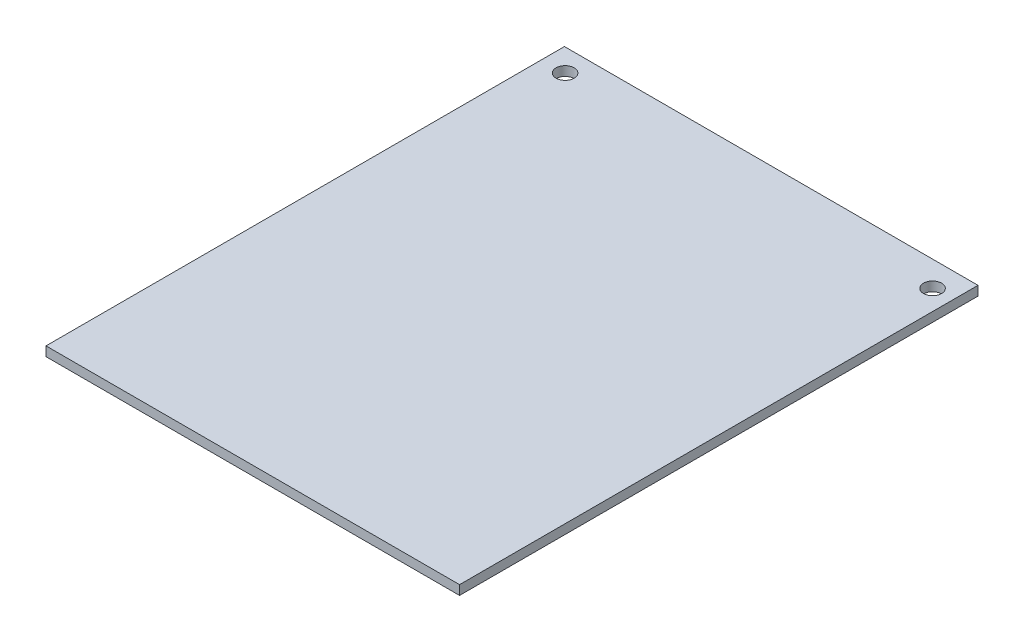
ISO-10303-21;
HEADER;
FILE_DESCRIPTION(('STEP AP214'),'2;1');
FILE_NAME('part.step','',(''),(''),'','','');
FILE_SCHEMA(('AUTOMOTIVE_DESIGN { 1 0 10303 214 1 1 1 1 }'));
ENDSEC;
DATA;
#1=APPLICATION_CONTEXT('core data for automotive mechanical design processes');
#2=APPLICATION_PROTOCOL_DEFINITION('international standard','automotive_design',2000,#1);
#3=PRODUCT_CONTEXT('',#1,'mechanical');
#4=PRODUCT('Part','Part','',(#3));
#5=PRODUCT_RELATED_PRODUCT_CATEGORY('part','',(#4));
#6=PRODUCT_DEFINITION_FORMATION('','',#4);
#7=PRODUCT_DEFINITION_CONTEXT('part definition',#1,'design');
#8=PRODUCT_DEFINITION('design','',#6,#7);
#9=PRODUCT_DEFINITION_SHAPE('','',#8);
#10=(LENGTH_UNIT() NAMED_UNIT(*) SI_UNIT(.MILLI.,.METRE.));
#11=(NAMED_UNIT(*) PLANE_ANGLE_UNIT() SI_UNIT($,.RADIAN.));
#12=(NAMED_UNIT(*) SI_UNIT($,.STERADIAN.) SOLID_ANGLE_UNIT());
#13=UNCERTAINTY_MEASURE_WITH_UNIT(LENGTH_MEASURE(1.E-05),#10,'distance_accuracy_value','');
#14=(GEOMETRIC_REPRESENTATION_CONTEXT(3) GLOBAL_UNCERTAINTY_ASSIGNED_CONTEXT((#13)) GLOBAL_UNIT_ASSIGNED_CONTEXT((#10,
#11,#12)) REPRESENTATION_CONTEXT('',''));
#15=CARTESIAN_POINT('',(0.,0.,0.));
#16=DIRECTION('',(0.,0.,1.));
#17=DIRECTION('',(1.,0.,0.));
#18=AXIS2_PLACEMENT_3D('',#15,#16,#17);
#19=CARTESIAN_POINT('',(0.,1.66,0.));
#20=DIRECTION('',(0.,1.,0.));
#21=DIRECTION('',(0.,0.,1.));
#22=AXIS2_PLACEMENT_3D('',#19,#20,#21);
#23=PLANE('',#22);
#24=CARTESIAN_POINT('',(27.6674074074074,1.66,-33.1692592592593));
#25=DIRECTION('',(0.,1.,0.));
#26=DIRECTION('',(0.,0.,1.));
#27=AXIS2_PLACEMENT_3D('',#24,#25,#26);
#28=CIRCLE('',#27,1.6);
#29=CARTESIAN_POINT('',(27.6674074074074,1.66,-34.7692592592593));
#30=VERTEX_POINT('',#29);
#31=EDGE_CURVE('E100',#30,#30,#28,.T.);
#32=ORIENTED_EDGE('',*,*,#31,.F.);
#33=EDGE_LOOP('',(#32));
#34=FACE_BOUND('',#33,.T.);
#35=DIRECTION('',(0.,0.,1.));
#36=VECTOR('',#35,1.);
#37=CARTESIAN_POINT('',(-42.0325925925926,1.66,-37.6592592592593));
#38=LINE('',#37,#36);
#39=CARTESIAN_POINT('',(-42.0325925925926,1.66,-37.6592592592593));
#40=VERTEX_POINT('',#39);
#41=CARTESIAN_POINT('',(-42.0325925925926,1.66,54.1807407407407));
#42=VERTEX_POINT('',#41);
#43=EDGE_CURVE('E85',#40,#42,#38,.T.);
#44=ORIENTED_EDGE('',*,*,#43,.T.);
#45=DIRECTION('',(1.,0.,0.));
#46=VECTOR('',#45,1.);
#47=CARTESIAN_POINT('',(-42.0325925925926,1.66,54.1807407407407));
#48=LINE('',#47,#46);
#49=CARTESIAN_POINT('',(31.2274074074074,1.66,54.1807407407407));
#50=VERTEX_POINT('',#49);
#51=EDGE_CURVE('E80',#42,#50,#48,.T.);
#52=ORIENTED_EDGE('',*,*,#51,.T.);
#53=DIRECTION('',(0.,0.,-1.));
#54=VECTOR('',#53,1.);
#55=CARTESIAN_POINT('',(31.2274074074074,1.66,-37.6592592592593));
#56=LINE('',#55,#54);
#57=CARTESIAN_POINT('',(31.2274074074074,1.66,-37.6592592592593));
#58=VERTEX_POINT('',#57);
#59=EDGE_CURVE('E83',#50,#58,#56,.T.);
#60=ORIENTED_EDGE('',*,*,#59,.T.);
#61=DIRECTION('',(-1.,0.,0.));
#62=VECTOR('',#61,1.);
#63=CARTESIAN_POINT('',(-42.0325925925926,1.66,-37.6592592592593));
#64=LINE('',#63,#62);
#65=EDGE_CURVE('E50',#58,#40,#64,.T.);
#66=ORIENTED_EDGE('',*,*,#65,.T.);
#67=EDGE_LOOP('',(#44,#52,#60,#66));
#68=FACE_BOUND('',#67,.T.);
#69=CARTESIAN_POINT('',(-37.9125925925926,1.66,-33.6592592592593));
#70=DIRECTION('',(0.,1.,0.));
#71=DIRECTION('',(0.,0.,1.));
#72=AXIS2_PLACEMENT_3D('',#69,#70,#71);
#73=CIRCLE('',#72,1.6);
#74=CARTESIAN_POINT('',(-37.9125925925926,1.66,-35.2592592592593));
#75=VERTEX_POINT('',#74);
#76=EDGE_CURVE('E115',#75,#75,#73,.T.);
#77=ORIENTED_EDGE('',*,*,#76,.F.);
#78=EDGE_LOOP('',(#77));
#79=FACE_BOUND('',#78,.T.);
#80=ADVANCED_FACE('F33',(#34,#68,#79),#23,.T.);
#81=CARTESIAN_POINT('',(0.,0.,0.));
#82=DIRECTION('',(0.,1.,0.));
#83=DIRECTION('',(0.,0.,1.));
#84=AXIS2_PLACEMENT_3D('',#81,#82,#83);
#85=PLANE('',#84);
#86=DIRECTION('',(0.,0.,1.));
#87=VECTOR('',#86,1.);
#88=CARTESIAN_POINT('',(-42.0325925925926,0.,-37.6592592592593));
#89=LINE('',#88,#87);
#90=CARTESIAN_POINT('',(-42.0325925925926,0.,-37.6592592592593));
#91=VERTEX_POINT('',#90);
#92=CARTESIAN_POINT('',(-42.0325925925926,0.,54.1807407407407));
#93=VERTEX_POINT('',#92);
#94=EDGE_CURVE('E97',#91,#93,#89,.T.);
#95=ORIENTED_EDGE('',*,*,#94,.F.);
#96=DIRECTION('',(-1.,0.,0.));
#97=VECTOR('',#96,1.);
#98=CARTESIAN_POINT('',(-42.0325925925926,0.,-37.6592592592593));
#99=LINE('',#98,#97);
#100=CARTESIAN_POINT('',(31.2274074074074,0.,-37.6592592592593));
#101=VERTEX_POINT('',#100);
#102=EDGE_CURVE('E73',#101,#91,#99,.T.);
#103=ORIENTED_EDGE('',*,*,#102,.F.);
#104=DIRECTION('',(0.,0.,-1.));
#105=VECTOR('',#104,1.);
#106=CARTESIAN_POINT('',(31.2274074074074,0.,-37.6592592592593));
#107=LINE('',#106,#105);
#108=CARTESIAN_POINT('',(31.2274074074074,0.,54.1807407407407));
#109=VERTEX_POINT('',#108);
#110=EDGE_CURVE('E67',#109,#101,#107,.T.);
#111=ORIENTED_EDGE('',*,*,#110,.F.);
#112=DIRECTION('',(1.,0.,0.));
#113=VECTOR('',#112,1.);
#114=CARTESIAN_POINT('',(-42.0325925925926,0.,54.1807407407407));
#115=LINE('',#114,#113);
#116=EDGE_CURVE('E89',#93,#109,#115,.T.);
#117=ORIENTED_EDGE('',*,*,#116,.F.);
#118=EDGE_LOOP('',(#95,#103,#111,#117));
#119=FACE_BOUND('',#118,.T.);
#120=CARTESIAN_POINT('',(27.6674074074074,0.,-33.1692592592593));
#121=DIRECTION('',(0.,1.,0.));
#122=DIRECTION('',(0.,0.,1.));
#123=AXIS2_PLACEMENT_3D('',#120,#121,#122);
#124=CIRCLE('',#123,1.6);
#125=CARTESIAN_POINT('',(27.6674074074074,0.,-34.7692592592593));
#126=VERTEX_POINT('',#125);
#127=EDGE_CURVE('E112',#126,#126,#124,.T.);
#128=ORIENTED_EDGE('',*,*,#127,.T.);
#129=EDGE_LOOP('',(#128));
#130=FACE_BOUND('',#129,.T.);
#131=CARTESIAN_POINT('',(-37.9125925925926,0.,-33.6592592592593));
#132=DIRECTION('',(0.,1.,0.));
#133=DIRECTION('',(0.,0.,1.));
#134=AXIS2_PLACEMENT_3D('',#131,#132,#133);
#135=CIRCLE('',#134,1.6);
#136=CARTESIAN_POINT('',(-37.9125925925926,0.,-35.2592592592593));
#137=VERTEX_POINT('',#136);
#138=EDGE_CURVE('E118',#137,#137,#135,.T.);
#139=ORIENTED_EDGE('',*,*,#138,.T.);
#140=EDGE_LOOP('',(#139));
#141=FACE_BOUND('',#140,.T.);
#142=ADVANCED_FACE('F108',(#119,#130,#141),#85,.F.);
#143=CARTESIAN_POINT('',(-42.0325925925926,1.66,-37.6592592592593));
#144=DIRECTION('',(1.,0.,0.));
#145=DIRECTION('',(0.,0.,-1.));
#146=AXIS2_PLACEMENT_3D('',#143,#144,#145);
#147=PLANE('',#146);
#148=ORIENTED_EDGE('',*,*,#94,.T.);
#149=DIRECTION('',(0.,-1.,0.));
#150=VECTOR('',#149,1.);
#151=CARTESIAN_POINT('',(-42.0325925925926,1.66,54.1807407407407));
#152=LINE('',#151,#150);
#153=EDGE_CURVE('E11',#42,#93,#152,.T.);
#154=ORIENTED_EDGE('',*,*,#153,.F.);
#155=ORIENTED_EDGE('',*,*,#43,.F.);
#156=DIRECTION('',(0.,-1.,0.));
#157=VECTOR('',#156,1.);
#158=CARTESIAN_POINT('',(-42.0325925925926,1.66,-37.6592592592593));
#159=LINE('',#158,#157);
#160=EDGE_CURVE('E93',#40,#91,#159,.T.);
#161=ORIENTED_EDGE('',*,*,#160,.T.);
#162=EDGE_LOOP('',(#148,#154,#155,#161));
#163=FACE_BOUND('',#162,.T.);
#164=ADVANCED_FACE('F35',(#163),#147,.F.);
#165=CARTESIAN_POINT('',(-42.0325925925926,1.66,54.1807407407407));
#166=DIRECTION('',(0.,0.,-1.));
#167=DIRECTION('',(-1.,0.,0.));
#168=AXIS2_PLACEMENT_3D('',#165,#166,#167);
#169=PLANE('',#168);
#170=ORIENTED_EDGE('',*,*,#116,.T.);
#171=DIRECTION('',(0.,-1.,0.));
#172=VECTOR('',#171,1.);
#173=CARTESIAN_POINT('',(31.2274074074074,1.66,54.1807407407407));
#174=LINE('',#173,#172);
#175=EDGE_CURVE('E42',#50,#109,#174,.T.);
#176=ORIENTED_EDGE('',*,*,#175,.F.);
#177=ORIENTED_EDGE('',*,*,#51,.F.);
#178=ORIENTED_EDGE('',*,*,#153,.T.);
#179=EDGE_LOOP('',(#170,#176,#177,#178));
#180=FACE_BOUND('',#179,.T.);
#181=ADVANCED_FACE('F88',(#180),#169,.F.);
#182=CARTESIAN_POINT('',(31.2274074074074,1.66,-37.6592592592593));
#183=DIRECTION('',(-1.,0.,0.));
#184=DIRECTION('',(0.,0.,1.));
#185=AXIS2_PLACEMENT_3D('',#182,#183,#184);
#186=PLANE('',#185);
#187=ORIENTED_EDGE('',*,*,#110,.T.);
#188=DIRECTION('',(0.,-1.,0.));
#189=VECTOR('',#188,1.);
#190=CARTESIAN_POINT('',(31.2274074074074,1.66,-37.6592592592593));
#191=LINE('',#190,#189);
#192=EDGE_CURVE('E90',#58,#101,#191,.T.);
#193=ORIENTED_EDGE('',*,*,#192,.F.);
#194=ORIENTED_EDGE('',*,*,#59,.F.);
#195=ORIENTED_EDGE('',*,*,#175,.T.);
#196=EDGE_LOOP('',(#187,#193,#194,#195));
#197=FACE_BOUND('',#196,.T.);
#198=ADVANCED_FACE('F91',(#197),#186,.F.);
#199=CARTESIAN_POINT('',(-42.0325925925926,1.66,-37.6592592592593));
#200=DIRECTION('',(0.,0.,1.));
#201=DIRECTION('',(1.,0.,0.));
#202=AXIS2_PLACEMENT_3D('',#199,#200,#201);
#203=PLANE('',#202);
#204=ORIENTED_EDGE('',*,*,#102,.T.);
#205=ORIENTED_EDGE('',*,*,#160,.F.);
#206=ORIENTED_EDGE('',*,*,#65,.F.);
#207=ORIENTED_EDGE('',*,*,#192,.T.);
#208=EDGE_LOOP('',(#204,#205,#206,#207));
#209=FACE_BOUND('',#208,.T.);
#210=ADVANCED_FACE('F105',(#209),#203,.F.);
#211=CARTESIAN_POINT('',(27.6674074074074,1.66,-33.1692592592593));
#212=DIRECTION('',(0.,-1.,0.));
#213=DIRECTION('',(0.,0.,-1.));
#214=AXIS2_PLACEMENT_3D('',#211,#212,#213);
#215=CYLINDRICAL_SURFACE('',#214,1.6);
#216=CARTESIAN_POINT('',(27.6674074074074,1.66,-34.7692592592593));
#217=CARTESIAN_POINT('',(27.6674074074074,1.64270833333333,-34.7692592592593));
#218=CARTESIAN_POINT('',(27.6674074074074,1.62541666666667,-34.7692592592593));
#219=CARTESIAN_POINT('',(27.6674074074074,1.59083333333333,-34.7692592592593));
#220=CARTESIAN_POINT('',(27.6674074074074,1.57354166666667,-34.7692592592593));
#221=CARTESIAN_POINT('',(27.6674074074074,1.53895833333333,-34.7692592592593));
#222=CARTESIAN_POINT('',(27.6674074074074,1.52166666666667,-34.7692592592593));
#223=CARTESIAN_POINT('',(27.6674074074074,1.48708333333333,-34.7692592592593));
#224=CARTESIAN_POINT('',(27.6674074074074,1.46979166666667,-34.7692592592593));
#225=CARTESIAN_POINT('',(27.6674074074074,1.43520833333333,-34.7692592592593));
#226=CARTESIAN_POINT('',(27.6674074074074,1.41791666666667,-34.7692592592593));
#227=CARTESIAN_POINT('',(27.6674074074074,1.38333333333333,-34.7692592592593));
#228=CARTESIAN_POINT('',(27.6674074074074,1.36604166666667,-34.7692592592593));
#229=CARTESIAN_POINT('',(27.6674074074074,1.33145833333333,-34.7692592592593));
#230=CARTESIAN_POINT('',(27.6674074074074,1.31416666666667,-34.7692592592593));
#231=CARTESIAN_POINT('',(27.6674074074074,1.27958333333333,-34.7692592592593));
#232=CARTESIAN_POINT('',(27.6674074074074,1.26229166666667,-34.7692592592593));
#233=CARTESIAN_POINT('',(27.6674074074074,1.22770833333333,-34.7692592592593));
#234=CARTESIAN_POINT('',(27.6674074074074,1.21041666666667,-34.7692592592593));
#235=CARTESIAN_POINT('',(27.6674074074074,1.17583333333333,-34.7692592592593));
#236=CARTESIAN_POINT('',(27.6674074074074,1.15854166666667,-34.7692592592593));
#237=CARTESIAN_POINT('',(27.6674074074074,1.12395833333333,-34.7692592592593));
#238=CARTESIAN_POINT('',(27.6674074074074,1.10666666666667,-34.7692592592593));
#239=CARTESIAN_POINT('',(27.6674074074074,1.07208333333333,-34.7692592592593));
#240=CARTESIAN_POINT('',(27.6674074074074,1.05479166666667,-34.7692592592593));
#241=CARTESIAN_POINT('',(27.6674074074074,1.02020833333333,-34.7692592592593));
#242=CARTESIAN_POINT('',(27.6674074074074,1.00291666666667,-34.7692592592593));
#243=CARTESIAN_POINT('',(27.6674074074074,0.968333333333333,-34.7692592592593));
#244=CARTESIAN_POINT('',(27.6674074074074,0.951041666666667,-34.7692592592593));
#245=CARTESIAN_POINT('',(27.6674074074074,0.916458333333333,-34.7692592592593));
#246=CARTESIAN_POINT('',(27.6674074074074,0.899166666666667,-34.7692592592593));
#247=CARTESIAN_POINT('',(27.6674074074074,0.864583333333333,-34.7692592592593));
#248=CARTESIAN_POINT('',(27.6674074074074,0.847291666666667,-34.7692592592593));
#249=CARTESIAN_POINT('',(27.6674074074074,0.812708333333333,-34.7692592592593));
#250=CARTESIAN_POINT('',(27.6674074074074,0.795416666666666,-34.7692592592593));
#251=CARTESIAN_POINT('',(27.6674074074074,0.760833333333333,-34.7692592592593));
#252=CARTESIAN_POINT('',(27.6674074074074,0.743541666666667,-34.7692592592593));
#253=CARTESIAN_POINT('',(27.6674074074074,0.708958333333333,-34.7692592592593));
#254=CARTESIAN_POINT('',(27.6674074074074,0.691666666666667,-34.7692592592593));
#255=CARTESIAN_POINT('',(27.6674074074074,0.657083333333333,-34.7692592592593));
#256=CARTESIAN_POINT('',(27.6674074074074,0.639791666666666,-34.7692592592593));
#257=CARTESIAN_POINT('',(27.6674074074074,0.605208333333333,-34.7692592592593));
#258=CARTESIAN_POINT('',(27.6674074074074,0.587916666666667,-34.7692592592593));
#259=CARTESIAN_POINT('',(27.6674074074074,0.553333333333333,-34.7692592592593));
#260=CARTESIAN_POINT('',(27.6674074074074,0.536041666666667,-34.7692592592593));
#261=CARTESIAN_POINT('',(27.6674074074074,0.501458333333333,-34.7692592592593));
#262=CARTESIAN_POINT('',(27.6674074074074,0.484166666666667,-34.7692592592593));
#263=CARTESIAN_POINT('',(27.6674074074074,0.449583333333333,-34.7692592592593));
#264=CARTESIAN_POINT('',(27.6674074074074,0.432291666666666,-34.7692592592593));
#265=CARTESIAN_POINT('',(27.6674074074074,0.397708333333333,-34.7692592592593));
#266=CARTESIAN_POINT('',(27.6674074074074,0.380416666666666,-34.7692592592593));
#267=CARTESIAN_POINT('',(27.6674074074074,0.345833333333333,-34.7692592592593));
#268=CARTESIAN_POINT('',(27.6674074074074,0.328541666666667,-34.7692592592593));
#269=CARTESIAN_POINT('',(27.6674074074074,0.293958333333333,-34.7692592592593));
#270=CARTESIAN_POINT('',(27.6674074074074,0.276666666666667,-34.7692592592593));
#271=CARTESIAN_POINT('',(27.6674074074074,0.242083333333333,-34.7692592592593));
#272=CARTESIAN_POINT('',(27.6674074074074,0.224791666666666,-34.7692592592593));
#273=CARTESIAN_POINT('',(27.6674074074074,0.190208333333333,-34.7692592592593));
#274=CARTESIAN_POINT('',(27.6674074074074,0.172916666666666,-34.7692592592593));
#275=CARTESIAN_POINT('',(27.6674074074074,0.138333333333333,-34.7692592592593));
#276=CARTESIAN_POINT('',(27.6674074074074,0.121041666666667,-34.7692592592593));
#277=CARTESIAN_POINT('',(27.6674074074074,0.0864583333333332,-34.7692592592593));
#278=CARTESIAN_POINT('',(27.6674074074074,0.0691666666666665,-34.7692592592593));
#279=CARTESIAN_POINT('',(27.6674074074074,0.0345833333333332,-34.7692592592593));
#280=CARTESIAN_POINT('',(27.6674074074074,0.0172916666666665,-34.7692592592593));
#281=CARTESIAN_POINT('',(27.6674074074074,0.,-34.7692592592593));
#282=B_SPLINE_CURVE_WITH_KNOTS('',3,(#216,#217,#218,#219,#220,#221,#222,#223,#224,#225,#226,
#227,#228,#229,#230,#231,#232,#233,#234,#235,#236,#237,#238,#239,#240,#241,#242,#243,#244,#245,
#246,#247,#248,#249,#250,#251,#252,#253,#254,#255,#256,#257,#258,#259,#260,#261,#262,#263,#264,
#265,#266,#267,#268,#269,#270,#271,#272,#273,#274,#275,#276,#277,#278,#279,#280,#281),
.UNSPECIFIED.,.F.,.F.,(4,2,2,2,2,2,2,2,2,2,2,2,2,2,2,2,2,2,2,2,2,2,2,2,2,2,2,2,2,2,2,2,4),(0.,
0.0518749999999998,0.10375,0.155625,0.2075,0.259375,0.31125,0.363125,0.415,0.466875,0.51875,
0.570625,0.6225,0.674375,0.72625,0.778125,0.83,0.881875,0.93375,0.985625,1.0375,1.089375,
1.14125,1.193125,1.245,1.296875,1.34875,1.400625,1.4525,1.504375,1.55625,1.608125,1.66),.UNSPECIFIED.);
#283=EDGE_CURVE('BSEAM135',#30,#126,#282,.T.);
#284=ORIENTED_EDGE('',*,*,#31,.T.);
#285=ORIENTED_EDGE('',*,*,#127,.F.);
#286=ORIENTED_EDGE('',*,*,#283,.T.);
#287=ORIENTED_EDGE('',*,*,#283,.F.);
#288=EDGE_LOOP('',(#284,#286,#285,#287));
#289=FACE_BOUND('',#288,.T.);
#290=ADVANCED_FACE('F135',(#289),#215,.F.);
#291=CARTESIAN_POINT('',(-37.9125925925926,1.66,-33.6592592592593));
#292=DIRECTION('',(0.,-1.,0.));
#293=DIRECTION('',(0.,0.,-1.));
#294=AXIS2_PLACEMENT_3D('',#291,#292,#293);
#295=CYLINDRICAL_SURFACE('',#294,1.6);
#296=CARTESIAN_POINT('',(-37.9125925925926,1.66,-35.2592592592593));
#297=CARTESIAN_POINT('',(-37.9125925925926,1.64270833333333,-35.2592592592593));
#298=CARTESIAN_POINT('',(-37.9125925925926,1.62541666666667,-35.2592592592593));
#299=CARTESIAN_POINT('',(-37.9125925925926,1.59083333333333,-35.2592592592593));
#300=CARTESIAN_POINT('',(-37.9125925925926,1.57354166666667,-35.2592592592593));
#301=CARTESIAN_POINT('',(-37.9125925925926,1.53895833333333,-35.2592592592593));
#302=CARTESIAN_POINT('',(-37.9125925925926,1.52166666666667,-35.2592592592593));
#303=CARTESIAN_POINT('',(-37.9125925925926,1.48708333333333,-35.2592592592593));
#304=CARTESIAN_POINT('',(-37.9125925925926,1.46979166666667,-35.2592592592593));
#305=CARTESIAN_POINT('',(-37.9125925925926,1.43520833333333,-35.2592592592593));
#306=CARTESIAN_POINT('',(-37.9125925925926,1.41791666666667,-35.2592592592593));
#307=CARTESIAN_POINT('',(-37.9125925925926,1.38333333333333,-35.2592592592593));
#308=CARTESIAN_POINT('',(-37.9125925925926,1.36604166666667,-35.2592592592593));
#309=CARTESIAN_POINT('',(-37.9125925925926,1.33145833333333,-35.2592592592593));
#310=CARTESIAN_POINT('',(-37.9125925925926,1.31416666666667,-35.2592592592593));
#311=CARTESIAN_POINT('',(-37.9125925925926,1.27958333333333,-35.2592592592593));
#312=CARTESIAN_POINT('',(-37.9125925925926,1.26229166666667,-35.2592592592593));
#313=CARTESIAN_POINT('',(-37.9125925925926,1.22770833333333,-35.2592592592593));
#314=CARTESIAN_POINT('',(-37.9125925925926,1.21041666666667,-35.2592592592593));
#315=CARTESIAN_POINT('',(-37.9125925925926,1.17583333333333,-35.2592592592593));
#316=CARTESIAN_POINT('',(-37.9125925925926,1.15854166666667,-35.2592592592593));
#317=CARTESIAN_POINT('',(-37.9125925925926,1.12395833333333,-35.2592592592593));
#318=CARTESIAN_POINT('',(-37.9125925925926,1.10666666666667,-35.2592592592593));
#319=CARTESIAN_POINT('',(-37.9125925925926,1.07208333333333,-35.2592592592593));
#320=CARTESIAN_POINT('',(-37.9125925925926,1.05479166666667,-35.2592592592593));
#321=CARTESIAN_POINT('',(-37.9125925925926,1.02020833333333,-35.2592592592593));
#322=CARTESIAN_POINT('',(-37.9125925925926,1.00291666666667,-35.2592592592593));
#323=CARTESIAN_POINT('',(-37.9125925925926,0.968333333333333,-35.2592592592593));
#324=CARTESIAN_POINT('',(-37.9125925925926,0.951041666666667,-35.2592592592593));
#325=CARTESIAN_POINT('',(-37.9125925925926,0.916458333333333,-35.2592592592593));
#326=CARTESIAN_POINT('',(-37.9125925925926,0.899166666666667,-35.2592592592593));
#327=CARTESIAN_POINT('',(-37.9125925925926,0.864583333333333,-35.2592592592593));
#328=CARTESIAN_POINT('',(-37.9125925925926,0.847291666666667,-35.2592592592593));
#329=CARTESIAN_POINT('',(-37.9125925925926,0.812708333333333,-35.2592592592593));
#330=CARTESIAN_POINT('',(-37.9125925925926,0.795416666666666,-35.2592592592593));
#331=CARTESIAN_POINT('',(-37.9125925925926,0.760833333333333,-35.2592592592593));
#332=CARTESIAN_POINT('',(-37.9125925925926,0.743541666666667,-35.2592592592593));
#333=CARTESIAN_POINT('',(-37.9125925925926,0.708958333333333,-35.2592592592593));
#334=CARTESIAN_POINT('',(-37.9125925925926,0.691666666666667,-35.2592592592593));
#335=CARTESIAN_POINT('',(-37.9125925925926,0.657083333333333,-35.2592592592593));
#336=CARTESIAN_POINT('',(-37.9125925925926,0.639791666666666,-35.2592592592593));
#337=CARTESIAN_POINT('',(-37.9125925925926,0.605208333333333,-35.2592592592593));
#338=CARTESIAN_POINT('',(-37.9125925925926,0.587916666666667,-35.2592592592593));
#339=CARTESIAN_POINT('',(-37.9125925925926,0.553333333333333,-35.2592592592593));
#340=CARTESIAN_POINT('',(-37.9125925925926,0.536041666666667,-35.2592592592593));
#341=CARTESIAN_POINT('',(-37.9125925925926,0.501458333333333,-35.2592592592593));
#342=CARTESIAN_POINT('',(-37.9125925925926,0.484166666666667,-35.2592592592593));
#343=CARTESIAN_POINT('',(-37.9125925925926,0.449583333333333,-35.2592592592593));
#344=CARTESIAN_POINT('',(-37.9125925925926,0.432291666666666,-35.2592592592593));
#345=CARTESIAN_POINT('',(-37.9125925925926,0.397708333333333,-35.2592592592593));
#346=CARTESIAN_POINT('',(-37.9125925925926,0.380416666666666,-35.2592592592593));
#347=CARTESIAN_POINT('',(-37.9125925925926,0.345833333333333,-35.2592592592593));
#348=CARTESIAN_POINT('',(-37.9125925925926,0.328541666666667,-35.2592592592593));
#349=CARTESIAN_POINT('',(-37.9125925925926,0.293958333333333,-35.2592592592593));
#350=CARTESIAN_POINT('',(-37.9125925925926,0.276666666666667,-35.2592592592593));
#351=CARTESIAN_POINT('',(-37.9125925925926,0.242083333333333,-35.2592592592593));
#352=CARTESIAN_POINT('',(-37.9125925925926,0.224791666666666,-35.2592592592593));
#353=CARTESIAN_POINT('',(-37.9125925925926,0.190208333333333,-35.2592592592593));
#354=CARTESIAN_POINT('',(-37.9125925925926,0.172916666666666,-35.2592592592593));
#355=CARTESIAN_POINT('',(-37.9125925925926,0.138333333333333,-35.2592592592593));
#356=CARTESIAN_POINT('',(-37.9125925925926,0.121041666666667,-35.2592592592593));
#357=CARTESIAN_POINT('',(-37.9125925925926,0.0864583333333332,-35.2592592592593));
#358=CARTESIAN_POINT('',(-37.9125925925926,0.0691666666666665,-35.2592592592593));
#359=CARTESIAN_POINT('',(-37.9125925925926,0.0345833333333332,-35.2592592592593));
#360=CARTESIAN_POINT('',(-37.9125925925926,0.0172916666666665,-35.2592592592593));
#361=CARTESIAN_POINT('',(-37.9125925925926,0.,-35.2592592592593));
#362=B_SPLINE_CURVE_WITH_KNOTS('',3,(#296,#297,#298,#299,#300,#301,#302,#303,#304,#305,#306,
#307,#308,#309,#310,#311,#312,#313,#314,#315,#316,#317,#318,#319,#320,#321,#322,#323,#324,#325,
#326,#327,#328,#329,#330,#331,#332,#333,#334,#335,#336,#337,#338,#339,#340,#341,#342,#343,#344,
#345,#346,#347,#348,#349,#350,#351,#352,#353,#354,#355,#356,#357,#358,#359,#360,#361),
.UNSPECIFIED.,.F.,.F.,(4,2,2,2,2,2,2,2,2,2,2,2,2,2,2,2,2,2,2,2,2,2,2,2,2,2,2,2,2,2,2,2,4),(0.,
0.0518749999999998,0.10375,0.155625,0.2075,0.259375,0.31125,0.363125,0.415,0.466875,0.51875,
0.570625,0.6225,0.674375,0.72625,0.778125,0.83,0.881875,0.93375,0.985625,1.0375,1.089375,
1.14125,1.193125,1.245,1.296875,1.34875,1.400625,1.4525,1.504375,1.55625,1.608125,1.66),.UNSPECIFIED.);
#363=EDGE_CURVE('BSEAM124',#75,#137,#362,.T.);
#364=ORIENTED_EDGE('',*,*,#76,.T.);
#365=ORIENTED_EDGE('',*,*,#138,.F.);
#366=ORIENTED_EDGE('',*,*,#363,.T.);
#367=ORIENTED_EDGE('',*,*,#363,.F.);
#368=EDGE_LOOP('',(#364,#366,#365,#367));
#369=FACE_BOUND('',#368,.T.);
#370=ADVANCED_FACE('F124',(#369),#295,.F.);
#371=CLOSED_SHELL('',(#80,#142,#164,#181,#198,#210,#290,#370));
#372=MANIFOLD_SOLID_BREP('B2',#371);
#373=ADVANCED_BREP_SHAPE_REPRESENTATION('',(#18,#372),#14);
#374=SHAPE_DEFINITION_REPRESENTATION(#9,#373);
ENDSEC;
END-ISO-10303-21;
